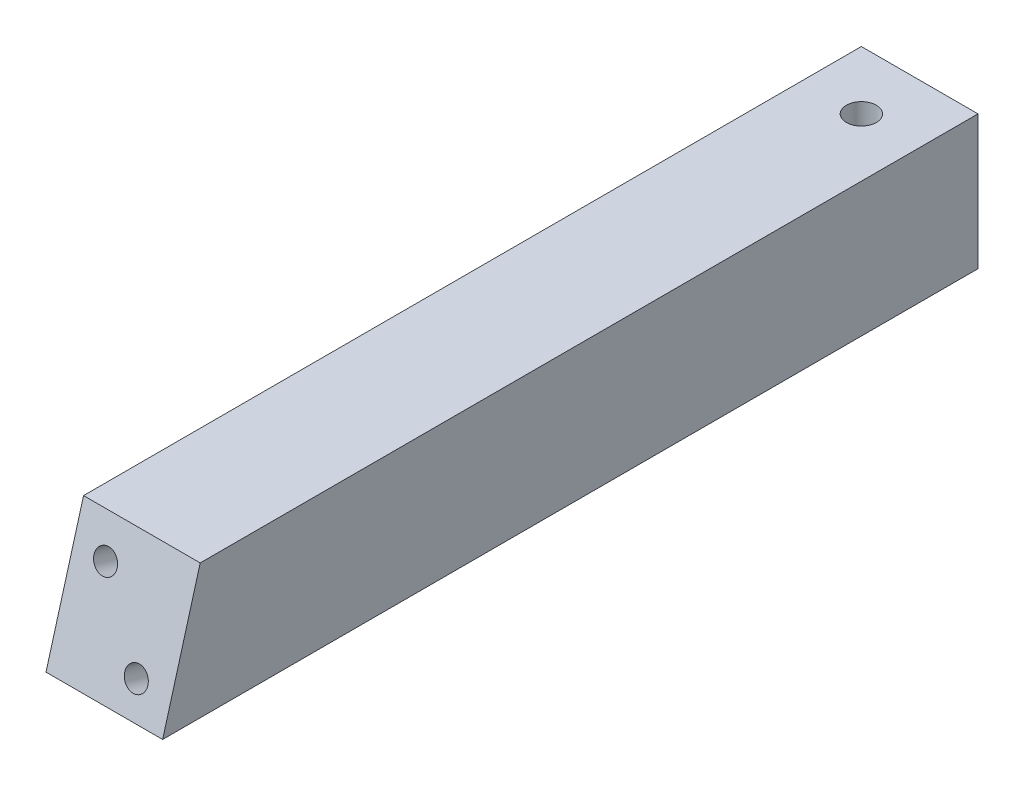
ISO-10303-21;
HEADER;
FILE_DESCRIPTION(('STEP AP214'),'2;1');
FILE_NAME('part.step','',(''),(''),'','','');
FILE_SCHEMA(('AUTOMOTIVE_DESIGN { 1 0 10303 214 1 1 1 1 }'));
ENDSEC;
DATA;
#1=APPLICATION_CONTEXT('core data for automotive mechanical design processes');
#2=APPLICATION_PROTOCOL_DEFINITION('international standard','automotive_design',2000,#1);
#3=PRODUCT_CONTEXT('',#1,'mechanical');
#4=PRODUCT('Part','Part','',(#3));
#5=PRODUCT_RELATED_PRODUCT_CATEGORY('part','',(#4));
#6=PRODUCT_DEFINITION_FORMATION('','',#4);
#7=PRODUCT_DEFINITION_CONTEXT('part definition',#1,'design');
#8=PRODUCT_DEFINITION('design','',#6,#7);
#9=PRODUCT_DEFINITION_SHAPE('','',#8);
#10=(LENGTH_UNIT() NAMED_UNIT(*) SI_UNIT(.MILLI.,.METRE.));
#11=(NAMED_UNIT(*) PLANE_ANGLE_UNIT() SI_UNIT($,.RADIAN.));
#12=(NAMED_UNIT(*) SI_UNIT($,.STERADIAN.) SOLID_ANGLE_UNIT());
#13=UNCERTAINTY_MEASURE_WITH_UNIT(LENGTH_MEASURE(1.E-05),#10,'distance_accuracy_value','');
#14=(GEOMETRIC_REPRESENTATION_CONTEXT(3) GLOBAL_UNCERTAINTY_ASSIGNED_CONTEXT((#13)) GLOBAL_UNIT_ASSIGNED_CONTEXT((#10,
#11,#12)) REPRESENTATION_CONTEXT('',''));
#15=CARTESIAN_POINT('',(0.,0.,0.));
#16=DIRECTION('',(0.,0.,1.));
#17=DIRECTION('',(1.,0.,0.));
#18=AXIS2_PLACEMENT_3D('',#15,#16,#17);
#19=CARTESIAN_POINT('',(0.,-14.605,-12.7));
#20=DIRECTION('',(0.,1.,0.));
#21=DIRECTION('',(0.,0.,-1.));
#22=AXIS2_PLACEMENT_3D('',#19,#20,#21);
#23=PLANE('',#22);
#24=DIRECTION('',(-1.,0.,0.));
#25=VECTOR('',#24,1.);
#26=CARTESIAN_POINT('',(0.,-14.605,145.067348417265));
#27=LINE('',#26,#25);
#28=CARTESIAN_POINT('',(6.99258936750368,-14.605,145.067348417265));
#29=VERTEX_POINT('',#28);
#30=CARTESIAN_POINT('',(3.16741063249632,-14.605,145.067348417265));
#31=VERTEX_POINT('',#30);
#32=EDGE_CURVE('E11',#29,#31,#27,.T.);
#33=ORIENTED_EDGE('',*,*,#32,.T.);
#34=CARTESIAN_POINT('',(5.08,-14.605,138.939159755567));
#35=DIRECTION('',(0.,-1.,0.));
#36=DIRECTION('',(0.,0.,1.));
#37=AXIS2_PLACEMENT_3D('',#34,#35,#36);
#38=ELLIPSE('',#37,9.37491821077206,2.5273);
#39=EDGE_CURVE('E90',#29,#31,#38,.T.);
#40=ORIENTED_EDGE('',*,*,#39,.F.);
#41=EDGE_LOOP('',(#33,#40));
#42=FACE_BOUND('',#41,.T.);
#43=CARTESIAN_POINT('',(0.,-14.605,0.));
#44=DIRECTION('',(0.,1.,0.));
#45=DIRECTION('',(0.,0.,1.));
#46=AXIS2_PLACEMENT_3D('',#43,#44,#45);
#47=CIRCLE('',#46,3.2639);
#48=CARTESIAN_POINT('',(0.,-14.605,3.2639));
#49=VERTEX_POINT('',#48);
#50=EDGE_CURVE('E93',#49,#49,#47,.T.);
#51=ORIENTED_EDGE('',*,*,#50,.T.);
#52=EDGE_LOOP('',(#51));
#53=FACE_BOUND('',#52,.T.);
#54=DIRECTION('',(1.,0.,0.));
#55=VECTOR('',#54,1.);
#56=CARTESIAN_POINT('',(0.,-14.605,164.849737725038));
#57=LINE('',#56,#55);
#58=CARTESIAN_POINT('',(-12.7,-14.605,164.849737725038));
#59=VERTEX_POINT('',#58);
#60=CARTESIAN_POINT('',(12.7,-14.605,164.849737725038));
#61=VERTEX_POINT('',#60);
#62=EDGE_CURVE('E106',#59,#61,#57,.T.);
#63=ORIENTED_EDGE('',*,*,#62,.F.);
#64=DIRECTION('',(0.,0.,1.));
#65=VECTOR('',#64,1.);
#66=CARTESIAN_POINT('',(-12.7,-14.605,-12.7));
#67=LINE('',#66,#65);
#68=CARTESIAN_POINT('',(-12.7,-14.605,-12.7));
#69=VERTEX_POINT('',#68);
#70=EDGE_CURVE('E108',#69,#59,#67,.T.);
#71=ORIENTED_EDGE('',*,*,#70,.F.);
#72=DIRECTION('',(1.,0.,0.));
#73=VECTOR('',#72,1.);
#74=CARTESIAN_POINT('',(0.,-14.605,-12.7));
#75=LINE('',#74,#73);
#76=CARTESIAN_POINT('',(12.7,-14.605,-12.7));
#77=VERTEX_POINT('',#76);
#78=EDGE_CURVE('E112',#69,#77,#75,.T.);
#79=ORIENTED_EDGE('',*,*,#78,.T.);
#80=DIRECTION('',(0.,0.,1.));
#81=VECTOR('',#80,1.);
#82=CARTESIAN_POINT('',(12.7,-14.605,-12.7));
#83=LINE('',#82,#81);
#84=EDGE_CURVE('E48',#77,#61,#83,.T.);
#85=ORIENTED_EDGE('',*,*,#84,.T.);
#86=EDGE_LOOP('',(#63,#71,#79,#85));
#87=FACE_BOUND('',#86,.T.);
#88=ADVANCED_FACE('F41',(#42,#53,#87),#23,.F.);
#89=CARTESIAN_POINT('',(12.7,0.,-12.7));
#90=DIRECTION('',(-1.,0.,0.));
#91=DIRECTION('',(0.,0.,-1.));
#92=AXIS2_PLACEMENT_3D('',#89,#90,#91);
#93=PLANE('',#92);
#94=DIRECTION('',(0.,0.962977712328957,-0.26958101854116));
#95=VECTOR('',#94,1.);
#96=CARTESIAN_POINT('',(12.7,-10.2420351219003,163.628346512511));
#97=LINE('',#96,#95);
#98=CARTESIAN_POINT('',(12.7,14.605,156.672537514928));
#99=VERTEX_POINT('',#98);
#100=EDGE_CURVE('E113',#61,#99,#97,.T.);
#101=ORIENTED_EDGE('',*,*,#100,.F.);
#102=ORIENTED_EDGE('',*,*,#84,.F.);
#103=DIRECTION('',(0.,1.,0.));
#104=VECTOR('',#103,1.);
#105=CARTESIAN_POINT('',(12.7,0.,-12.7));
#106=LINE('',#105,#104);
#107=CARTESIAN_POINT('',(12.7,14.605,-12.7));
#108=VERTEX_POINT('',#107);
#109=EDGE_CURVE('E115',#77,#108,#106,.T.);
#110=ORIENTED_EDGE('',*,*,#109,.T.);
#111=DIRECTION('',(0.,0.,1.));
#112=VECTOR('',#111,1.);
#113=CARTESIAN_POINT('',(12.7,14.605,-12.7));
#114=LINE('',#113,#112);
#115=EDGE_CURVE('E134',#108,#99,#114,.T.);
#116=ORIENTED_EDGE('',*,*,#115,.T.);
#117=EDGE_LOOP('',(#101,#102,#110,#116));
#118=FACE_BOUND('',#117,.T.);
#119=ADVANCED_FACE('F98',(#118),#93,.F.);
#120=CARTESIAN_POINT('',(0.,14.605,-12.7));
#121=DIRECTION('',(0.,1.,0.));
#122=DIRECTION('',(0.,0.,-1.));
#123=AXIS2_PLACEMENT_3D('',#120,#121,#122);
#124=PLANE('',#123);
#125=CARTESIAN_POINT('',(0.,14.605,0.));
#126=DIRECTION('',(0.,1.,0.));
#127=DIRECTION('',(0.,0.,1.));
#128=AXIS2_PLACEMENT_3D('',#125,#126,#127);
#129=CIRCLE('',#128,3.2639);
#130=CARTESIAN_POINT('',(0.,14.605,3.2639));
#131=VERTEX_POINT('',#130);
#132=EDGE_CURVE('E123',#131,#131,#129,.T.);
#133=ORIENTED_EDGE('',*,*,#132,.F.);
#134=EDGE_LOOP('',(#133));
#135=FACE_BOUND('',#134,.T.);
#136=DIRECTION('',(1.,0.,0.));
#137=VECTOR('',#136,1.);
#138=CARTESIAN_POINT('',(0.,14.605,156.672537514928));
#139=LINE('',#138,#137);
#140=CARTESIAN_POINT('',(-12.7,14.605,156.672537514928));
#141=VERTEX_POINT('',#140);
#142=EDGE_CURVE('E117',#141,#99,#139,.T.);
#143=ORIENTED_EDGE('',*,*,#142,.T.);
#144=ORIENTED_EDGE('',*,*,#115,.F.);
#145=DIRECTION('',(1.,0.,0.));
#146=VECTOR('',#145,1.);
#147=CARTESIAN_POINT('',(0.,14.605,-12.7));
#148=LINE('',#147,#146);
#149=CARTESIAN_POINT('',(-12.7,14.605,-12.7));
#150=VERTEX_POINT('',#149);
#151=EDGE_CURVE('E127',#150,#108,#148,.T.);
#152=ORIENTED_EDGE('',*,*,#151,.F.);
#153=DIRECTION('',(0.,0.,1.));
#154=VECTOR('',#153,1.);
#155=CARTESIAN_POINT('',(-12.7,14.605,-12.7));
#156=LINE('',#155,#154);
#157=EDGE_CURVE('E131',#150,#141,#156,.T.);
#158=ORIENTED_EDGE('',*,*,#157,.T.);
#159=EDGE_LOOP('',(#143,#144,#152,#158));
#160=FACE_BOUND('',#159,.T.);
#161=ADVANCED_FACE('F142',(#135,#160),#124,.T.);
#162=CARTESIAN_POINT('',(-12.7,0.,-12.7));
#163=DIRECTION('',(-1.,0.,0.));
#164=DIRECTION('',(0.,0.,-1.));
#165=AXIS2_PLACEMENT_3D('',#162,#163,#164);
#166=PLANE('',#165);
#167=DIRECTION('',(0.,0.962977712328957,-0.26958101854116));
#168=VECTOR('',#167,1.);
#169=CARTESIAN_POINT('',(-12.7,-10.2420351219003,163.628346512511));
#170=LINE('',#169,#168);
#171=EDGE_CURVE('E121',#59,#141,#170,.T.);
#172=ORIENTED_EDGE('',*,*,#171,.T.);
#173=ORIENTED_EDGE('',*,*,#157,.F.);
#174=DIRECTION('',(0.,1.,0.));
#175=VECTOR('',#174,1.);
#176=CARTESIAN_POINT('',(-12.7,0.,-12.7));
#177=LINE('',#176,#175);
#178=EDGE_CURVE('E62',#69,#150,#177,.T.);
#179=ORIENTED_EDGE('',*,*,#178,.F.);
#180=ORIENTED_EDGE('',*,*,#70,.T.);
#181=EDGE_LOOP('',(#172,#173,#179,#180));
#182=FACE_BOUND('',#181,.T.);
#183=ADVANCED_FACE('F143',(#182),#166,.T.);
#184=CARTESIAN_POINT('',(0.,0.,-12.7));
#185=DIRECTION('',(0.,0.,-1.));
#186=DIRECTION('',(1.,0.,0.));
#187=AXIS2_PLACEMENT_3D('',#184,#185,#186);
#188=PLANE('',#187);
#189=ORIENTED_EDGE('',*,*,#78,.F.);
#190=ORIENTED_EDGE('',*,*,#178,.T.);
#191=ORIENTED_EDGE('',*,*,#151,.T.);
#192=ORIENTED_EDGE('',*,*,#109,.F.);
#193=EDGE_LOOP('',(#189,#190,#191,#192));
#194=FACE_BOUND('',#193,.T.);
#195=ADVANCED_FACE('F145',(#194),#188,.T.);
#196=CARTESIAN_POINT('',(-223.778265585856,534.660082965459,11.0855969571136));
#197=DIRECTION('',(0.,0.26958101854116,0.962977712328957));
#198=DIRECTION('',(0.,0.962977712328957,-0.26958101854116));
#199=AXIS2_PLACEMENT_3D('',#196,#197,#198);
#200=PLANE('',#199);
#201=CARTESIAN_POINT('',(-5.71499999999999,6.79717965651112,158.85829958796));
#202=DIRECTION('',(0.,-0.26958101854116,-0.962977712328957));
#203=DIRECTION('',(0.,0.962977712328957,-0.26958101854116));
#204=AXIS2_PLACEMENT_3D('',#201,#202,#203);
#205=CIRCLE('',#204,2.5273);
#206=CARTESIAN_POINT('',(-5.71499999999999,9.2309132288801,158.176987479801));
#207=VERTEX_POINT('',#206);
#208=EDGE_CURVE('E247',#207,#207,#205,.T.);
#209=ORIENTED_EDGE('',*,*,#208,.T.);
#210=EDGE_LOOP('',(#209));
#211=FACE_BOUND('',#210,.T.);
#212=CARTESIAN_POINT('',(5.08,-7.87860067938218,162.966714310528));
#213=DIRECTION('',(0.,-0.26958101854116,-0.962977712328957));
#214=DIRECTION('',(0.,0.962977712328957,-0.26958101854116));
#215=AXIS2_PLACEMENT_3D('',#212,#213,#214);
#216=CIRCLE('',#215,2.5273);
#217=CARTESIAN_POINT('',(5.08,-5.44486710701321,162.285402202369));
#218=VERTEX_POINT('',#217);
#219=EDGE_CURVE('E88',#218,#218,#216,.T.);
#220=ORIENTED_EDGE('',*,*,#219,.T.);
#221=EDGE_LOOP('',(#220));
#222=FACE_BOUND('',#221,.T.);
#223=ORIENTED_EDGE('',*,*,#62,.T.);
#224=ORIENTED_EDGE('',*,*,#100,.T.);
#225=ORIENTED_EDGE('',*,*,#142,.F.);
#226=ORIENTED_EDGE('',*,*,#171,.F.);
#227=EDGE_LOOP('',(#223,#224,#225,#226));
#228=FACE_BOUND('',#227,.T.);
#229=ADVANCED_FACE('F141',(#211,#222,#228),#200,.T.);
#230=CARTESIAN_POINT('',(0.,14.605,0.));
#231=DIRECTION('',(0.,-1.,0.));
#232=DIRECTION('',(0.,0.,1.));
#233=AXIS2_PLACEMENT_3D('',#230,#231,#232);
#234=CYLINDRICAL_SURFACE('',#233,3.2639);
#235=ORIENTED_EDGE('',*,*,#132,.T.);
#236=EDGE_LOOP('',(#235));
#237=FACE_BOUND('',#236,.T.);
#238=ORIENTED_EDGE('',*,*,#50,.F.);
#239=EDGE_LOOP('',(#238));
#240=FACE_BOUND('',#239,.T.);
#241=ADVANCED_FACE('F185',(#237,#240),#234,.F.);
#242=CARTESIAN_POINT('',(5.08,-13.0141190825913,144.621988890661));
#243=DIRECTION('',(0.,0.26958101854116,0.962977712328957));
#244=DIRECTION('',(0.,0.962977712328957,-0.26958101854116));
#245=AXIS2_PLACEMENT_3D('',#242,#243,#244);
#246=PLANE('',#245);
#247=ORIENTED_EDGE('',*,*,#32,.F.);
#248=CARTESIAN_POINT('',(5.08,-13.0141190825913,144.621988890661));
#249=DIRECTION('',(0.,-0.26958101854116,-0.962977712328957));
#250=DIRECTION('',(0.,0.962977712328957,-0.26958101854116));
#251=AXIS2_PLACEMENT_3D('',#248,#249,#250);
#252=CIRCLE('',#251,2.5273);
#253=EDGE_CURVE('E54',#31,#29,#252,.T.);
#254=ORIENTED_EDGE('',*,*,#253,.F.);
#255=EDGE_LOOP('',(#247,#254));
#256=FACE_BOUND('',#255,.T.);
#257=ADVANCED_FACE('F87',(#256),#246,.T.);
#258=CARTESIAN_POINT('',(5.08,-13.0141190825913,144.621988890661));
#259=DIRECTION('',(0.,0.26958101854116,0.962977712328957));
#260=DIRECTION('',(0.,0.962977712328957,-0.26958101854116));
#261=AXIS2_PLACEMENT_3D('',#258,#259,#260);
#262=CYLINDRICAL_SURFACE('',#261,2.5273);
#263=ORIENTED_EDGE('',*,*,#219,.F.);
#264=EDGE_LOOP('',(#263));
#265=FACE_BOUND('',#264,.T.);
#266=ORIENTED_EDGE('',*,*,#253,.T.);
#267=ORIENTED_EDGE('',*,*,#39,.T.);
#268=EDGE_LOOP('',(#266,#267));
#269=FACE_BOUND('',#268,.T.);
#270=ADVANCED_FACE('F91',(#265,#269),#262,.F.);
#271=CARTESIAN_POINT('',(-5.715,1.66166125330202,140.513574168094));
#272=DIRECTION('',(0.,0.26958101854116,0.962977712328957));
#273=DIRECTION('',(0.,0.962977712328957,-0.26958101854116));
#274=AXIS2_PLACEMENT_3D('',#271,#272,#273);
#275=CYLINDRICAL_SURFACE('',#274,2.5273);
#276=CARTESIAN_POINT('',(-5.715,1.66166125330202,140.513574168094));
#277=DIRECTION('',(0.,-0.26958101854116,-0.962977712328957));
#278=DIRECTION('',(0.,0.962977712328957,-0.26958101854116));
#279=AXIS2_PLACEMENT_3D('',#276,#277,#278);
#280=CIRCLE('',#279,2.5273);
#281=CARTESIAN_POINT('',(-5.715,4.09539482567099,139.832262059935));
#282=VERTEX_POINT('',#281);
#283=EDGE_CURVE('E94',#282,#282,#280,.T.);
#284=ORIENTED_EDGE('',*,*,#283,.T.);
#285=EDGE_LOOP('',(#284));
#286=FACE_BOUND('',#285,.T.);
#287=ORIENTED_EDGE('',*,*,#208,.F.);
#288=EDGE_LOOP('',(#287));
#289=FACE_BOUND('',#288,.T.);
#290=ADVANCED_FACE('F200',(#286,#289),#275,.F.);
#291=CARTESIAN_POINT('',(-5.715,1.66166125330202,140.513574168094));
#292=DIRECTION('',(0.,0.26958101854116,0.962977712328957));
#293=DIRECTION('',(0.,0.962977712328957,-0.26958101854116));
#294=AXIS2_PLACEMENT_3D('',#291,#292,#293);
#295=PLANE('',#294);
#296=ORIENTED_EDGE('',*,*,#283,.F.);
#297=EDGE_LOOP('',(#296));
#298=FACE_BOUND('',#297,.T.);
#299=ADVANCED_FACE('F209',(#298),#295,.T.);
#300=CLOSED_SHELL('',(#88,#119,#161,#183,#195,#229,#241,#257,#270,#290,#299));
#301=MANIFOLD_SOLID_BREP('B2',#300);
#302=ADVANCED_BREP_SHAPE_REPRESENTATION('',(#18,#301),#14);
#303=SHAPE_DEFINITION_REPRESENTATION(#9,#302);
ENDSEC;
END-ISO-10303-21;
